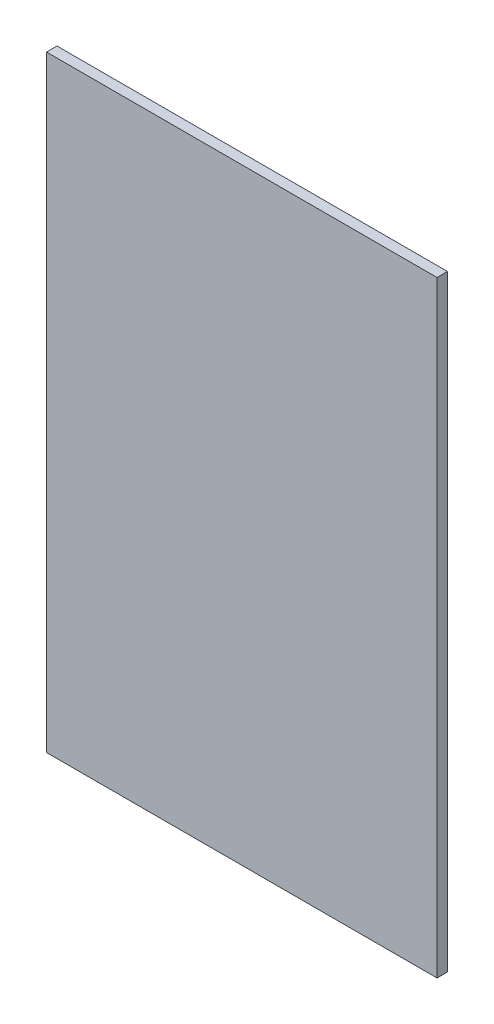
ISO-10303-21;
HEADER;
FILE_DESCRIPTION(('STEP AP214'),'2;1');
FILE_NAME('part.step','',(''),(''),'','','');
FILE_SCHEMA(('AUTOMOTIVE_DESIGN { 1 0 10303 214 1 1 1 1 }'));
ENDSEC;
DATA;
#1=APPLICATION_CONTEXT('core data for automotive mechanical design processes');
#2=APPLICATION_PROTOCOL_DEFINITION('international standard','automotive_design',2000,#1);
#3=PRODUCT_CONTEXT('',#1,'mechanical');
#4=PRODUCT('Part','Part','',(#3));
#5=PRODUCT_RELATED_PRODUCT_CATEGORY('part','',(#4));
#6=PRODUCT_DEFINITION_FORMATION('','',#4);
#7=PRODUCT_DEFINITION_CONTEXT('part definition',#1,'design');
#8=PRODUCT_DEFINITION('design','',#6,#7);
#9=PRODUCT_DEFINITION_SHAPE('','',#8);
#10=(LENGTH_UNIT() NAMED_UNIT(*) SI_UNIT(.MILLI.,.METRE.));
#11=(NAMED_UNIT(*) PLANE_ANGLE_UNIT() SI_UNIT($,.RADIAN.));
#12=(NAMED_UNIT(*) SI_UNIT($,.STERADIAN.) SOLID_ANGLE_UNIT());
#13=UNCERTAINTY_MEASURE_WITH_UNIT(LENGTH_MEASURE(1.E-05),#10,'distance_accuracy_value','');
#14=(GEOMETRIC_REPRESENTATION_CONTEXT(3) GLOBAL_UNCERTAINTY_ASSIGNED_CONTEXT((#13)) GLOBAL_UNIT_ASSIGNED_CONTEXT((#10,
#11,#12)) REPRESENTATION_CONTEXT('',''));
#15=CARTESIAN_POINT('',(0.,0.,0.));
#16=DIRECTION('',(0.,0.,1.));
#17=DIRECTION('',(1.,0.,0.));
#18=AXIS2_PLACEMENT_3D('',#15,#16,#17);
#19=CARTESIAN_POINT('',(1.17,0.546,0.24));
#20=DIRECTION('',(-1.,0.,0.));
#21=DIRECTION('',(0.,0.,1.));
#22=AXIS2_PLACEMENT_3D('',#19,#20,#21);
#23=PLANE('',#22);
#24=DIRECTION('',(0.,0.,-1.));
#25=VECTOR('',#24,1.);
#26=CARTESIAN_POINT('',(1.17,0.87,0.22));
#27=LINE('',#26,#25);
#28=CARTESIAN_POINT('',(1.17,0.87,-0.22));
#29=VERTEX_POINT('',#28);
#30=CARTESIAN_POINT('',(1.17,0.87,-0.25));
#31=VERTEX_POINT('',#30);
#32=EDGE_CURVE('E87',#29,#31,#27,.T.);
#33=ORIENTED_EDGE('',*,*,#32,.F.);
#34=DIRECTION('',(0.,-1.,0.));
#35=VECTOR('',#34,1.);
#36=CARTESIAN_POINT('',(1.17,-0.784,-0.22));
#37=LINE('',#36,#35);
#38=CARTESIAN_POINT('',(1.17,-0.87,-0.22));
#39=VERTEX_POINT('',#38);
#40=EDGE_CURVE('E37',#29,#39,#37,.T.);
#41=ORIENTED_EDGE('',*,*,#40,.T.);
#42=DIRECTION('',(0.,0.,1.));
#43=VECTOR('',#42,1.);
#44=CARTESIAN_POINT('',(1.17,-0.87,0.22));
#45=LINE('',#44,#43);
#46=CARTESIAN_POINT('',(1.17,-0.87,-0.25));
#47=VERTEX_POINT('',#46);
#48=EDGE_CURVE('E56',#47,#39,#45,.T.);
#49=ORIENTED_EDGE('',*,*,#48,.F.);
#50=DIRECTION('',(0.,1.,0.));
#51=VECTOR('',#50,1.);
#52=CARTESIAN_POINT('',(1.17,0.,-0.25));
#53=LINE('',#52,#51);
#54=EDGE_CURVE('E92',#47,#31,#53,.T.);
#55=ORIENTED_EDGE('',*,*,#54,.T.);
#56=EDGE_LOOP('',(#33,#41,#49,#55));
#57=FACE_BOUND('',#56,.T.);
#58=ADVANCED_FACE('F33',(#57),#23,.F.);
#59=CARTESIAN_POINT('',(0.05,0.832,0.24));
#60=DIRECTION('',(1.,0.,0.));
#61=DIRECTION('',(0.,0.,-1.));
#62=AXIS2_PLACEMENT_3D('',#59,#60,#61);
#63=PLANE('',#62);
#64=DIRECTION('',(0.,-1.,0.));
#65=VECTOR('',#64,1.);
#66=CARTESIAN_POINT('',(0.05,0.,-0.25));
#67=LINE('',#66,#65);
#68=CARTESIAN_POINT('',(0.0499999999999999,0.87,-0.25));
#69=VERTEX_POINT('',#68);
#70=CARTESIAN_POINT('',(0.0499999999999999,-0.87,-0.25));
#71=VERTEX_POINT('',#70);
#72=EDGE_CURVE('E91',#69,#71,#67,.T.);
#73=ORIENTED_EDGE('',*,*,#72,.T.);
#74=DIRECTION('',(0.,0.,-1.));
#75=VECTOR('',#74,1.);
#76=CARTESIAN_POINT('',(0.05,-0.87,0.22));
#77=LINE('',#76,#75);
#78=CARTESIAN_POINT('',(0.05,-0.87,-0.22));
#79=VERTEX_POINT('',#78);
#80=EDGE_CURVE('E80',#79,#71,#77,.T.);
#81=ORIENTED_EDGE('',*,*,#80,.F.);
#82=DIRECTION('',(0.,-1.,0.));
#83=VECTOR('',#82,1.);
#84=CARTESIAN_POINT('',(0.05,0.832,-0.22));
#85=LINE('',#84,#83);
#86=CARTESIAN_POINT('',(0.05,0.87,-0.220000000012988));
#87=VERTEX_POINT('',#86);
#88=EDGE_CURVE('E11',#87,#79,#85,.T.);
#89=ORIENTED_EDGE('',*,*,#88,.F.);
#90=DIRECTION('',(0.,0.,1.));
#91=VECTOR('',#90,1.);
#92=CARTESIAN_POINT('',(0.05,0.87,0.22));
#93=LINE('',#92,#91);
#94=EDGE_CURVE('E78',#69,#87,#93,.T.);
#95=ORIENTED_EDGE('',*,*,#94,.F.);
#96=EDGE_LOOP('',(#73,#81,#89,#95));
#97=FACE_BOUND('',#96,.T.);
#98=ADVANCED_FACE('F77',(#97),#63,.F.);
#99=CARTESIAN_POINT('',(1.17,0.832,-0.22));
#100=DIRECTION('',(0.,0.,1.));
#101=DIRECTION('',(0.,-1.,0.));
#102=AXIS2_PLACEMENT_3D('',#99,#100,#101);
#103=PLANE('',#102);
#104=ORIENTED_EDGE('',*,*,#40,.F.);
#105=DIRECTION('',(-1.,0.,0.));
#106=VECTOR('',#105,1.);
#107=CARTESIAN_POINT('',(0.03,0.87,-0.22));
#108=LINE('',#107,#106);
#109=EDGE_CURVE('E84',#29,#87,#108,.T.);
#110=ORIENTED_EDGE('',*,*,#109,.T.);
#111=ORIENTED_EDGE('',*,*,#88,.T.);
#112=DIRECTION('',(-1.,0.,0.));
#113=VECTOR('',#112,1.);
#114=CARTESIAN_POINT('',(1.22,-0.87,-0.22));
#115=LINE('',#114,#113);
#116=EDGE_CURVE('E42',#39,#79,#115,.T.);
#117=ORIENTED_EDGE('',*,*,#116,.F.);
#118=EDGE_LOOP('',(#104,#110,#111,#117));
#119=FACE_BOUND('',#118,.T.);
#120=ADVANCED_FACE('F89',(#119),#103,.T.);
#121=CARTESIAN_POINT('',(0.,0.,-0.25));
#122=DIRECTION('',(0.,0.,-1.));
#123=DIRECTION('',(0.,1.,0.));
#124=AXIS2_PLACEMENT_3D('',#121,#122,#123);
#125=PLANE('',#124);
#126=ORIENTED_EDGE('',*,*,#54,.F.);
#127=DIRECTION('',(-1.,0.,0.));
#128=VECTOR('',#127,1.);
#129=CARTESIAN_POINT('',(1.22,-0.87,-0.25));
#130=LINE('',#129,#128);
#131=EDGE_CURVE('E98',#47,#71,#130,.T.);
#132=ORIENTED_EDGE('',*,*,#131,.T.);
#133=ORIENTED_EDGE('',*,*,#72,.F.);
#134=DIRECTION('',(1.,0.,0.));
#135=VECTOR('',#134,1.);
#136=CARTESIAN_POINT('',(1.22,0.87,-0.25));
#137=LINE('',#136,#135);
#138=EDGE_CURVE('E86',#69,#31,#137,.T.);
#139=ORIENTED_EDGE('',*,*,#138,.T.);
#140=EDGE_LOOP('',(#126,#132,#133,#139));
#141=FACE_BOUND('',#140,.T.);
#142=ADVANCED_FACE('F106',(#141),#125,.T.);
#143=CARTESIAN_POINT('',(0.03,-0.87,0.22));
#144=DIRECTION('',(0.,1.,0.));
#145=DIRECTION('',(0.,0.,1.));
#146=AXIS2_PLACEMENT_3D('',#143,#144,#145);
#147=PLANE('',#146);
#148=ORIENTED_EDGE('',*,*,#131,.F.);
#149=ORIENTED_EDGE('',*,*,#48,.T.);
#150=ORIENTED_EDGE('',*,*,#116,.T.);
#151=ORIENTED_EDGE('',*,*,#80,.T.);
#152=EDGE_LOOP('',(#148,#149,#150,#151));
#153=FACE_BOUND('',#152,.T.);
#154=ADVANCED_FACE('F107',(#153),#147,.F.);
#155=CARTESIAN_POINT('',(0.03,0.87,0.22));
#156=DIRECTION('',(0.,-1.,0.));
#157=DIRECTION('',(0.,0.,-1.));
#158=AXIS2_PLACEMENT_3D('',#155,#156,#157);
#159=PLANE('',#158);
#160=ORIENTED_EDGE('',*,*,#109,.F.);
#161=ORIENTED_EDGE('',*,*,#32,.T.);
#162=ORIENTED_EDGE('',*,*,#138,.F.);
#163=ORIENTED_EDGE('',*,*,#94,.T.);
#164=EDGE_LOOP('',(#160,#161,#162,#163));
#165=FACE_BOUND('',#164,.T.);
#166=ADVANCED_FACE('F35',(#165),#159,.F.);
#167=CLOSED_SHELL('',(#58,#98,#120,#142,#154,#166));
#168=MANIFOLD_SOLID_BREP('B2',#167);
#169=ADVANCED_BREP_SHAPE_REPRESENTATION('',(#18,#168),#14);
#170=SHAPE_DEFINITION_REPRESENTATION(#9,#169);
ENDSEC;
END-ISO-10303-21;
